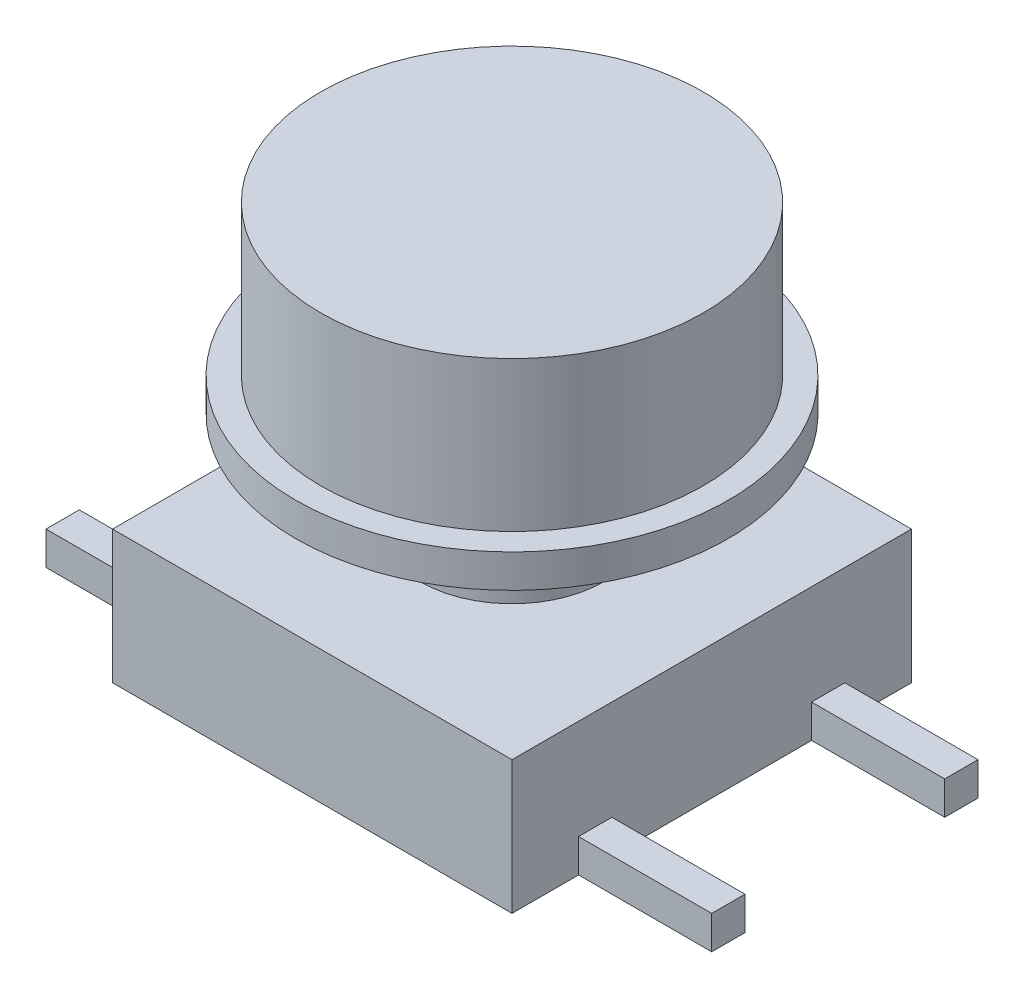
ISO-10303-21;
HEADER;
FILE_DESCRIPTION(('STEP AP214'),'2;1');
FILE_NAME('part.step','',(''),(''),'','','');
FILE_SCHEMA(('AUTOMOTIVE_DESIGN { 1 0 10303 214 1 1 1 1 }'));
ENDSEC;
DATA;
#1=APPLICATION_CONTEXT('core data for automotive mechanical design processes');
#2=APPLICATION_PROTOCOL_DEFINITION('international standard','automotive_design',2000,#1);
#3=PRODUCT_CONTEXT('',#1,'mechanical');
#4=PRODUCT('Part','Part','',(#3));
#5=PRODUCT_RELATED_PRODUCT_CATEGORY('part','',(#4));
#6=PRODUCT_DEFINITION_FORMATION('','',#4);
#7=PRODUCT_DEFINITION_CONTEXT('part definition',#1,'design');
#8=PRODUCT_DEFINITION('design','',#6,#7);
#9=PRODUCT_DEFINITION_SHAPE('','',#8);
#10=(LENGTH_UNIT() NAMED_UNIT(*) SI_UNIT(.MILLI.,.METRE.));
#11=(NAMED_UNIT(*) PLANE_ANGLE_UNIT() SI_UNIT($,.RADIAN.));
#12=(NAMED_UNIT(*) SI_UNIT($,.STERADIAN.) SOLID_ANGLE_UNIT());
#13=UNCERTAINTY_MEASURE_WITH_UNIT(LENGTH_MEASURE(1.E-05),#10,'distance_accuracy_value','');
#14=(GEOMETRIC_REPRESENTATION_CONTEXT(3) GLOBAL_UNCERTAINTY_ASSIGNED_CONTEXT((#13)) GLOBAL_UNIT_ASSIGNED_CONTEXT((#10,
#11,#12)) REPRESENTATION_CONTEXT('',''));
#15=CARTESIAN_POINT('',(0.,0.,0.));
#16=DIRECTION('',(0.,0.,1.));
#17=DIRECTION('',(1.,0.,0.));
#18=AXIS2_PLACEMENT_3D('',#15,#16,#17);
#19=CARTESIAN_POINT('',(-6.,4.,6.));
#20=DIRECTION('',(1.,0.,0.));
#21=DIRECTION('',(0.,0.,-1.));
#22=AXIS2_PLACEMENT_3D('',#19,#20,#21);
#23=PLANE('',#22);
#24=DIRECTION('',(0.,0.,1.));
#25=VECTOR('',#24,1.);
#26=CARTESIAN_POINT('',(-6.,0.,6.));
#27=LINE('',#26,#25);
#28=CARTESIAN_POINT('',(-6.,0.,-3.));
#29=VERTEX_POINT('',#28);
#30=CARTESIAN_POINT('',(-6.,0.,3.));
#31=VERTEX_POINT('',#30);
#32=EDGE_CURVE('E400',#29,#31,#27,.T.);
#33=ORIENTED_EDGE('',*,*,#32,.T.);
#34=DIRECTION('',(0.,1.,0.));
#35=VECTOR('',#34,1.);
#36=CARTESIAN_POINT('',(-6.,1.,3.));
#37=LINE('',#36,#35);
#38=CARTESIAN_POINT('',(-6.,1.,3.));
#39=VERTEX_POINT('',#38);
#40=EDGE_CURVE('E65',#31,#39,#37,.T.);
#41=ORIENTED_EDGE('',*,*,#40,.T.);
#42=DIRECTION('',(0.,0.,1.));
#43=VECTOR('',#42,1.);
#44=CARTESIAN_POINT('',(-6.,1.,4.));
#45=LINE('',#44,#43);
#46=CARTESIAN_POINT('',(-6.,1.,4.));
#47=VERTEX_POINT('',#46);
#48=EDGE_CURVE('E60',#39,#47,#45,.T.);
#49=ORIENTED_EDGE('',*,*,#48,.T.);
#50=DIRECTION('',(0.,-1.,0.));
#51=VECTOR('',#50,1.);
#52=CARTESIAN_POINT('',(-6.,1.,4.));
#53=LINE('',#52,#51);
#54=CARTESIAN_POINT('',(-6.,0.,4.));
#55=VERTEX_POINT('',#54);
#56=EDGE_CURVE('E218',#47,#55,#53,.T.);
#57=ORIENTED_EDGE('',*,*,#56,.T.);
#58=CARTESIAN_POINT('',(-6.,0.,6.));
#59=VERTEX_POINT('',#58);
#60=EDGE_CURVE('E396',#55,#59,#27,.T.);
#61=ORIENTED_EDGE('',*,*,#60,.T.);
#62=DIRECTION('',(0.,-1.,0.));
#63=VECTOR('',#62,1.);
#64=CARTESIAN_POINT('',(-6.,4.,6.));
#65=LINE('',#64,#63);
#66=CARTESIAN_POINT('',(-6.,4.,6.));
#67=VERTEX_POINT('',#66);
#68=EDGE_CURVE('E406',#67,#59,#65,.T.);
#69=ORIENTED_EDGE('',*,*,#68,.F.);
#70=DIRECTION('',(0.,0.,1.));
#71=VECTOR('',#70,1.);
#72=CARTESIAN_POINT('',(-6.,4.,6.));
#73=LINE('',#72,#71);
#74=CARTESIAN_POINT('',(-6.,4.,-6.));
#75=VERTEX_POINT('',#74);
#76=EDGE_CURVE('E382',#75,#67,#73,.T.);
#77=ORIENTED_EDGE('',*,*,#76,.F.);
#78=DIRECTION('',(0.,-1.,0.));
#79=VECTOR('',#78,1.);
#80=CARTESIAN_POINT('',(-6.,4.,-6.));
#81=LINE('',#80,#79);
#82=CARTESIAN_POINT('',(-6.,0.,-6.));
#83=VERTEX_POINT('',#82);
#84=EDGE_CURVE('E409',#75,#83,#81,.T.);
#85=ORIENTED_EDGE('',*,*,#84,.T.);
#86=CARTESIAN_POINT('',(-6.,0.,-4.));
#87=VERTEX_POINT('',#86);
#88=EDGE_CURVE('E397',#83,#87,#27,.T.);
#89=ORIENTED_EDGE('',*,*,#88,.T.);
#90=DIRECTION('',(0.,-1.,0.));
#91=VECTOR('',#90,1.);
#92=CARTESIAN_POINT('',(-6.,1.,-4.));
#93=LINE('',#92,#91);
#94=CARTESIAN_POINT('',(-6.,1.,-4.));
#95=VERTEX_POINT('',#94);
#96=EDGE_CURVE('E235',#95,#87,#93,.T.);
#97=ORIENTED_EDGE('',*,*,#96,.F.);
#98=DIRECTION('',(0.,0.,-1.));
#99=VECTOR('',#98,1.);
#100=CARTESIAN_POINT('',(-6.,1.,-4.));
#101=LINE('',#100,#99);
#102=CARTESIAN_POINT('',(-6.,1.,-3.));
#103=VERTEX_POINT('',#102);
#104=EDGE_CURVE('E248',#103,#95,#101,.T.);
#105=ORIENTED_EDGE('',*,*,#104,.F.);
#106=DIRECTION('',(0.,1.,0.));
#107=VECTOR('',#106,1.);
#108=CARTESIAN_POINT('',(-6.,1.,-3.));
#109=LINE('',#108,#107);
#110=EDGE_CURVE('E191',#29,#103,#109,.T.);
#111=ORIENTED_EDGE('',*,*,#110,.F.);
#112=EDGE_LOOP('',(#33,#41,#49,#57,#61,#69,#77,#85,#89,#97,#105,#111));
#113=FACE_BOUND('',#112,.T.);
#114=ADVANCED_FACE('F43',(#113),#23,.F.);
#115=CARTESIAN_POINT('',(6.,4.,6.));
#116=DIRECTION('',(-1.,0.,0.));
#117=DIRECTION('',(0.,0.,1.));
#118=AXIS2_PLACEMENT_3D('',#115,#116,#117);
#119=PLANE('',#118);
#120=DIRECTION('',(0.,0.,-1.));
#121=VECTOR('',#120,1.);
#122=CARTESIAN_POINT('',(6.,0.,6.));
#123=LINE('',#122,#121);
#124=CARTESIAN_POINT('',(6.,0.,3.));
#125=VERTEX_POINT('',#124);
#126=CARTESIAN_POINT('',(6.,0.,-3.));
#127=VERTEX_POINT('',#126);
#128=EDGE_CURVE('E393',#125,#127,#123,.T.);
#129=ORIENTED_EDGE('',*,*,#128,.T.);
#130=DIRECTION('',(0.,1.,0.));
#131=VECTOR('',#130,1.);
#132=CARTESIAN_POINT('',(6.,1.,-3.));
#133=LINE('',#132,#131);
#134=CARTESIAN_POINT('',(6.,1.,-3.));
#135=VERTEX_POINT('',#134);
#136=EDGE_CURVE('E270',#127,#135,#133,.T.);
#137=ORIENTED_EDGE('',*,*,#136,.T.);
#138=DIRECTION('',(0.,0.,-1.));
#139=VECTOR('',#138,1.);
#140=CARTESIAN_POINT('',(6.,1.,-4.));
#141=LINE('',#140,#139);
#142=CARTESIAN_POINT('',(6.,1.,-4.));
#143=VERTEX_POINT('',#142);
#144=EDGE_CURVE('E276',#135,#143,#141,.T.);
#145=ORIENTED_EDGE('',*,*,#144,.T.);
#146=DIRECTION('',(0.,-1.,0.));
#147=VECTOR('',#146,1.);
#148=CARTESIAN_POINT('',(6.,1.,-4.));
#149=LINE('',#148,#147);
#150=CARTESIAN_POINT('',(6.,0.,-4.));
#151=VERTEX_POINT('',#150);
#152=EDGE_CURVE('E291',#143,#151,#149,.T.);
#153=ORIENTED_EDGE('',*,*,#152,.T.);
#154=CARTESIAN_POINT('',(6.,0.,-6.));
#155=VERTEX_POINT('',#154);
#156=EDGE_CURVE('E372',#151,#155,#123,.T.);
#157=ORIENTED_EDGE('',*,*,#156,.T.);
#158=DIRECTION('',(0.,-1.,0.));
#159=VECTOR('',#158,1.);
#160=CARTESIAN_POINT('',(6.,4.,-6.));
#161=LINE('',#160,#159);
#162=CARTESIAN_POINT('',(6.,4.,-6.));
#163=VERTEX_POINT('',#162);
#164=EDGE_CURVE('E47',#163,#155,#161,.T.);
#165=ORIENTED_EDGE('',*,*,#164,.F.);
#166=DIRECTION('',(0.,0.,-1.));
#167=VECTOR('',#166,1.);
#168=CARTESIAN_POINT('',(6.,4.,6.));
#169=LINE('',#168,#167);
#170=CARTESIAN_POINT('',(6.,4.,6.));
#171=VERTEX_POINT('',#170);
#172=EDGE_CURVE('E374',#171,#163,#169,.T.);
#173=ORIENTED_EDGE('',*,*,#172,.F.);
#174=DIRECTION('',(0.,-1.,0.));
#175=VECTOR('',#174,1.);
#176=CARTESIAN_POINT('',(6.,4.,6.));
#177=LINE('',#176,#175);
#178=CARTESIAN_POINT('',(6.,0.,6.));
#179=VERTEX_POINT('',#178);
#180=EDGE_CURVE('E388',#171,#179,#177,.T.);
#181=ORIENTED_EDGE('',*,*,#180,.T.);
#182=CARTESIAN_POINT('',(6.,0.,4.));
#183=VERTEX_POINT('',#182);
#184=EDGE_CURVE('E389',#179,#183,#123,.T.);
#185=ORIENTED_EDGE('',*,*,#184,.T.);
#186=DIRECTION('',(0.,-1.,0.));
#187=VECTOR('',#186,1.);
#188=CARTESIAN_POINT('',(6.,1.,4.));
#189=LINE('',#188,#187);
#190=CARTESIAN_POINT('',(6.,1.,4.));
#191=VERTEX_POINT('',#190);
#192=EDGE_CURVE('E318',#191,#183,#189,.T.);
#193=ORIENTED_EDGE('',*,*,#192,.F.);
#194=DIRECTION('',(0.,0.,1.));
#195=VECTOR('',#194,1.);
#196=CARTESIAN_POINT('',(6.,1.,4.));
#197=LINE('',#196,#195);
#198=CARTESIAN_POINT('',(6.,1.,3.));
#199=VERTEX_POINT('',#198);
#200=EDGE_CURVE('E331',#199,#191,#197,.T.);
#201=ORIENTED_EDGE('',*,*,#200,.F.);
#202=DIRECTION('',(0.,1.,0.));
#203=VECTOR('',#202,1.);
#204=CARTESIAN_POINT('',(6.,1.,3.));
#205=LINE('',#204,#203);
#206=EDGE_CURVE('E312',#125,#199,#205,.T.);
#207=ORIENTED_EDGE('',*,*,#206,.F.);
#208=EDGE_LOOP('',(#129,#137,#145,#153,#157,#165,#173,#181,#185,#193,#201,#207));
#209=FACE_BOUND('',#208,.T.);
#210=ADVANCED_FACE('F45',(#209),#119,.F.);
#211=CARTESIAN_POINT('',(-6.,4.,-6.));
#212=DIRECTION('',(0.,0.,1.));
#213=DIRECTION('',(1.,0.,0.));
#214=AXIS2_PLACEMENT_3D('',#211,#212,#213);
#215=PLANE('',#214);
#216=DIRECTION('',(-1.,0.,0.));
#217=VECTOR('',#216,1.);
#218=CARTESIAN_POINT('',(-6.,0.,-6.));
#219=LINE('',#218,#217);
#220=EDGE_CURVE('E392',#155,#83,#219,.T.);
#221=ORIENTED_EDGE('',*,*,#220,.T.);
#222=ORIENTED_EDGE('',*,*,#84,.F.);
#223=DIRECTION('',(-1.,0.,0.));
#224=VECTOR('',#223,1.);
#225=CARTESIAN_POINT('',(-6.,4.,-6.));
#226=LINE('',#225,#224);
#227=EDGE_CURVE('E378',#163,#75,#226,.T.);
#228=ORIENTED_EDGE('',*,*,#227,.F.);
#229=ORIENTED_EDGE('',*,*,#164,.T.);
#230=EDGE_LOOP('',(#221,#222,#228,#229));
#231=FACE_BOUND('',#230,.T.);
#232=ADVANCED_FACE('F419',(#231),#215,.F.);
#233=CARTESIAN_POINT('',(-6.,4.,6.));
#234=DIRECTION('',(0.,0.,-1.));
#235=DIRECTION('',(-1.,0.,0.));
#236=AXIS2_PLACEMENT_3D('',#233,#234,#235);
#237=PLANE('',#236);
#238=DIRECTION('',(1.,0.,0.));
#239=VECTOR('',#238,1.);
#240=CARTESIAN_POINT('',(-6.,0.,6.));
#241=LINE('',#240,#239);
#242=EDGE_CURVE('E379',#59,#179,#241,.T.);
#243=ORIENTED_EDGE('',*,*,#242,.T.);
#244=ORIENTED_EDGE('',*,*,#180,.F.);
#245=DIRECTION('',(1.,0.,0.));
#246=VECTOR('',#245,1.);
#247=CARTESIAN_POINT('',(-6.,4.,6.));
#248=LINE('',#247,#246);
#249=EDGE_CURVE('E385',#67,#171,#248,.T.);
#250=ORIENTED_EDGE('',*,*,#249,.F.);
#251=ORIENTED_EDGE('',*,*,#68,.T.);
#252=EDGE_LOOP('',(#243,#244,#250,#251));
#253=FACE_BOUND('',#252,.T.);
#254=ADVANCED_FACE('F456',(#253),#237,.F.);
#255=CARTESIAN_POINT('',(0.,4.,0.));
#256=DIRECTION('',(0.,-1.,0.));
#257=DIRECTION('',(0.,0.,-1.));
#258=AXIS2_PLACEMENT_3D('',#255,#256,#257);
#259=PLANE('',#258);
#260=CARTESIAN_POINT('',(0.,4.,0.));
#261=DIRECTION('',(0.,1.,0.));
#262=DIRECTION('',(0.,0.,1.));
#263=AXIS2_PLACEMENT_3D('',#260,#261,#262);
#264=CIRCLE('',#263,2.75);
#265=CARTESIAN_POINT('',(0.,4.,2.75));
#266=VERTEX_POINT('',#265);
#267=EDGE_CURVE('E11',#266,#266,#264,.T.);
#268=ORIENTED_EDGE('',*,*,#267,.F.);
#269=EDGE_LOOP('',(#268));
#270=FACE_BOUND('',#269,.T.);
#271=ORIENTED_EDGE('',*,*,#172,.T.);
#272=ORIENTED_EDGE('',*,*,#227,.T.);
#273=ORIENTED_EDGE('',*,*,#76,.T.);
#274=ORIENTED_EDGE('',*,*,#249,.T.);
#275=EDGE_LOOP('',(#271,#272,#273,#274));
#276=FACE_BOUND('',#275,.T.);
#277=ADVANCED_FACE('F462',(#270,#276),#259,.F.);
#278=CARTESIAN_POINT('',(0.,0.,0.));
#279=DIRECTION('',(0.,-1.,0.));
#280=DIRECTION('',(0.,0.,-1.));
#281=AXIS2_PLACEMENT_3D('',#278,#279,#280);
#282=PLANE('',#281);
#283=ORIENTED_EDGE('',*,*,#184,.F.);
#284=ORIENTED_EDGE('',*,*,#242,.F.);
#285=ORIENTED_EDGE('',*,*,#60,.F.);
#286=DIRECTION('',(1.,0.,0.));
#287=VECTOR('',#286,1.);
#288=CARTESIAN_POINT('',(-10.,0.,4.));
#289=LINE('',#288,#287);
#290=CARTESIAN_POINT('',(-10.,0.,4.));
#291=VERTEX_POINT('',#290);
#292=EDGE_CURVE('E192',#291,#55,#289,.T.);
#293=ORIENTED_EDGE('',*,*,#292,.F.);
#294=DIRECTION('',(0.,0.,-1.));
#295=VECTOR('',#294,1.);
#296=CARTESIAN_POINT('',(-10.,0.,4.));
#297=LINE('',#296,#295);
#298=CARTESIAN_POINT('',(-10.,0.,3.));
#299=VERTEX_POINT('',#298);
#300=EDGE_CURVE('E198',#291,#299,#297,.T.);
#301=ORIENTED_EDGE('',*,*,#300,.T.);
#302=DIRECTION('',(1.,0.,0.));
#303=VECTOR('',#302,1.);
#304=CARTESIAN_POINT('',(-10.,0.,3.));
#305=LINE('',#304,#303);
#306=EDGE_CURVE('E182',#299,#31,#305,.T.);
#307=ORIENTED_EDGE('',*,*,#306,.T.);
#308=ORIENTED_EDGE('',*,*,#32,.F.);
#309=DIRECTION('',(1.,0.,0.));
#310=VECTOR('',#309,1.);
#311=CARTESIAN_POINT('',(-10.,0.,-3.));
#312=LINE('',#311,#310);
#313=CARTESIAN_POINT('',(-10.,0.,-3.));
#314=VERTEX_POINT('',#313);
#315=EDGE_CURVE('E244',#314,#29,#312,.T.);
#316=ORIENTED_EDGE('',*,*,#315,.F.);
#317=DIRECTION('',(0.,0.,1.));
#318=VECTOR('',#317,1.);
#319=CARTESIAN_POINT('',(-10.,0.,-4.));
#320=LINE('',#319,#318);
#321=CARTESIAN_POINT('',(-10.,0.,-4.));
#322=VERTEX_POINT('',#321);
#323=EDGE_CURVE('E241',#322,#314,#320,.T.);
#324=ORIENTED_EDGE('',*,*,#323,.F.);
#325=DIRECTION('',(1.,0.,0.));
#326=VECTOR('',#325,1.);
#327=CARTESIAN_POINT('',(-10.,0.,-4.));
#328=LINE('',#327,#326);
#329=EDGE_CURVE('E258',#322,#87,#328,.T.);
#330=ORIENTED_EDGE('',*,*,#329,.T.);
#331=ORIENTED_EDGE('',*,*,#88,.F.);
#332=ORIENTED_EDGE('',*,*,#220,.F.);
#333=ORIENTED_EDGE('',*,*,#156,.F.);
#334=DIRECTION('',(-1.,0.,0.));
#335=VECTOR('',#334,1.);
#336=CARTESIAN_POINT('',(10.,0.,-4.));
#337=LINE('',#336,#335);
#338=CARTESIAN_POINT('',(10.,0.,-4.));
#339=VERTEX_POINT('',#338);
#340=EDGE_CURVE('E304',#339,#151,#337,.T.);
#341=ORIENTED_EDGE('',*,*,#340,.F.);
#342=DIRECTION('',(0.,0.,1.));
#343=VECTOR('',#342,1.);
#344=CARTESIAN_POINT('',(10.,0.,-4.));
#345=LINE('',#344,#343);
#346=CARTESIAN_POINT('',(10.,0.,-3.));
#347=VERTEX_POINT('',#346);
#348=EDGE_CURVE('E275',#339,#347,#345,.T.);
#349=ORIENTED_EDGE('',*,*,#348,.T.);
#350=DIRECTION('',(-1.,0.,0.));
#351=VECTOR('',#350,1.);
#352=CARTESIAN_POINT('',(10.,0.,-3.));
#353=LINE('',#352,#351);
#354=EDGE_CURVE('E308',#347,#127,#353,.T.);
#355=ORIENTED_EDGE('',*,*,#354,.T.);
#356=ORIENTED_EDGE('',*,*,#128,.F.);
#357=DIRECTION('',(-1.,0.,0.));
#358=VECTOR('',#357,1.);
#359=CARTESIAN_POINT('',(10.,0.,3.));
#360=LINE('',#359,#358);
#361=CARTESIAN_POINT('',(10.,0.,3.));
#362=VERTEX_POINT('',#361);
#363=EDGE_CURVE('E327',#362,#125,#360,.T.);
#364=ORIENTED_EDGE('',*,*,#363,.F.);
#365=DIRECTION('',(0.,0.,-1.));
#366=VECTOR('',#365,1.);
#367=CARTESIAN_POINT('',(10.,0.,4.));
#368=LINE('',#367,#366);
#369=CARTESIAN_POINT('',(10.,0.,4.));
#370=VERTEX_POINT('',#369);
#371=EDGE_CURVE('E324',#370,#362,#368,.T.);
#372=ORIENTED_EDGE('',*,*,#371,.F.);
#373=DIRECTION('',(-1.,0.,0.));
#374=VECTOR('',#373,1.);
#375=CARTESIAN_POINT('',(10.,0.,4.));
#376=LINE('',#375,#374);
#377=EDGE_CURVE('E341',#370,#183,#376,.T.);
#378=ORIENTED_EDGE('',*,*,#377,.T.);
#379=EDGE_LOOP('',(#283,#284,#285,#293,#301,#307,#308,#316,#324,#330,#331,#332,#333,#341,#349,
#355,#356,#364,#372,#378));
#380=FACE_BOUND('',#379,.T.);
#381=ADVANCED_FACE('F205',(#380),#282,.T.);
#382=CARTESIAN_POINT('',(0.,7.,0.));
#383=DIRECTION('',(0.,-1.,0.));
#384=DIRECTION('',(0.,0.,-1.));
#385=AXIS2_PLACEMENT_3D('',#382,#383,#384);
#386=CYLINDRICAL_SURFACE('',#385,2.75);
#387=CARTESIAN_POINT('',(0.,7.,0.));
#388=DIRECTION('',(0.,1.,0.));
#389=DIRECTION('',(0.,0.,1.));
#390=AXIS2_PLACEMENT_3D('',#387,#388,#389);
#391=CIRCLE('',#390,2.75);
#392=CARTESIAN_POINT('',(0.,7.,2.75));
#393=VERTEX_POINT('',#392);
#394=EDGE_CURVE('E366',#393,#393,#391,.T.);
#395=ORIENTED_EDGE('',*,*,#394,.F.);
#396=EDGE_LOOP('',(#395));
#397=FACE_BOUND('',#396,.T.);
#398=ORIENTED_EDGE('',*,*,#267,.T.);
#399=EDGE_LOOP('',(#398));
#400=FACE_BOUND('',#399,.T.);
#401=ADVANCED_FACE('F549',(#397,#400),#386,.T.);
#402=CARTESIAN_POINT('',(0.,8.,0.));
#403=DIRECTION('',(0.,-1.,0.));
#404=DIRECTION('',(0.,0.,-1.));
#405=AXIS2_PLACEMENT_3D('',#402,#403,#404);
#406=CYLINDRICAL_SURFACE('',#405,6.5);
#407=CARTESIAN_POINT('',(0.,8.,0.));
#408=DIRECTION('',(0.,1.,0.));
#409=DIRECTION('',(0.,0.,1.));
#410=AXIS2_PLACEMENT_3D('',#407,#408,#409);
#411=CIRCLE('',#410,6.5);
#412=CARTESIAN_POINT('',(0.,8.,6.5));
#413=VERTEX_POINT('',#412);
#414=EDGE_CURVE('E362',#413,#413,#411,.T.);
#415=ORIENTED_EDGE('',*,*,#414,.F.);
#416=EDGE_LOOP('',(#415));
#417=FACE_BOUND('',#416,.T.);
#418=CARTESIAN_POINT('',(0.,7.,0.));
#419=DIRECTION('',(0.,1.,0.));
#420=DIRECTION('',(0.,0.,1.));
#421=AXIS2_PLACEMENT_3D('',#418,#419,#420);
#422=CIRCLE('',#421,6.5);
#423=CARTESIAN_POINT('',(0.,7.,6.5));
#424=VERTEX_POINT('',#423);
#425=EDGE_CURVE('E361',#424,#424,#422,.T.);
#426=ORIENTED_EDGE('',*,*,#425,.T.);
#427=EDGE_LOOP('',(#426));
#428=FACE_BOUND('',#427,.T.);
#429=ADVANCED_FACE('F686',(#417,#428),#406,.T.);
#430=CARTESIAN_POINT('',(0.,8.,0.));
#431=DIRECTION('',(0.,1.,0.));
#432=DIRECTION('',(0.,0.,1.));
#433=AXIS2_PLACEMENT_3D('',#430,#431,#432);
#434=PLANE('',#433);
#435=CARTESIAN_POINT('',(0.,8.,0.));
#436=DIRECTION('',(0.,1.,0.));
#437=DIRECTION('',(0.,0.,1.));
#438=AXIS2_PLACEMENT_3D('',#435,#436,#437);
#439=CIRCLE('',#438,5.75);
#440=CARTESIAN_POINT('',(0.,8.,5.75));
#441=VERTEX_POINT('',#440);
#442=EDGE_CURVE('E357',#441,#441,#439,.F.);
#443=ORIENTED_EDGE('',*,*,#442,.T.);
#444=EDGE_LOOP('',(#443));
#445=FACE_BOUND('',#444,.T.);
#446=ORIENTED_EDGE('',*,*,#414,.T.);
#447=EDGE_LOOP('',(#446));
#448=FACE_BOUND('',#447,.T.);
#449=ADVANCED_FACE('F675',(#445,#448),#434,.T.);
#450=CARTESIAN_POINT('',(0.,7.,0.));
#451=DIRECTION('',(0.,1.,0.));
#452=DIRECTION('',(0.,0.,1.));
#453=AXIS2_PLACEMENT_3D('',#450,#451,#452);
#454=PLANE('',#453);
#455=ORIENTED_EDGE('',*,*,#425,.F.);
#456=EDGE_LOOP('',(#455));
#457=FACE_BOUND('',#456,.T.);
#458=ORIENTED_EDGE('',*,*,#394,.T.);
#459=EDGE_LOOP('',(#458));
#460=FACE_BOUND('',#459,.T.);
#461=ADVANCED_FACE('F664',(#457,#460),#454,.F.);
#462=CARTESIAN_POINT('',(0.,12.5,0.));
#463=DIRECTION('',(0.,-1.,0.));
#464=DIRECTION('',(0.,0.,-1.));
#465=AXIS2_PLACEMENT_3D('',#462,#463,#464);
#466=CYLINDRICAL_SURFACE('',#465,5.75);
#467=ORIENTED_EDGE('',*,*,#442,.F.);
#468=EDGE_LOOP('',(#467));
#469=FACE_BOUND('',#468,.T.);
#470=CARTESIAN_POINT('',(0.,12.5,0.));
#471=DIRECTION('',(0.,1.,0.));
#472=DIRECTION('',(0.,0.,1.));
#473=AXIS2_PLACEMENT_3D('',#470,#471,#472);
#474=CIRCLE('',#473,5.75);
#475=CARTESIAN_POINT('',(0.,12.5,5.75));
#476=VERTEX_POINT('',#475);
#477=EDGE_CURVE('E353',#476,#476,#474,.T.);
#478=ORIENTED_EDGE('',*,*,#477,.F.);
#479=EDGE_LOOP('',(#478));
#480=FACE_BOUND('',#479,.T.);
#481=ADVANCED_FACE('F654',(#469,#480),#466,.T.);
#482=CARTESIAN_POINT('',(0.,12.5,0.));
#483=DIRECTION('',(0.,1.,0.));
#484=DIRECTION('',(0.,0.,1.));
#485=AXIS2_PLACEMENT_3D('',#482,#483,#484);
#486=PLANE('',#485);
#487=ORIENTED_EDGE('',*,*,#477,.T.);
#488=EDGE_LOOP('',(#487));
#489=FACE_BOUND('',#488,.T.);
#490=ADVANCED_FACE('F644',(#489),#486,.T.);
#491=CARTESIAN_POINT('',(10.,1.,3.));
#492=DIRECTION('',(0.,0.,1.));
#493=DIRECTION('',(0.,-1.,0.));
#494=AXIS2_PLACEMENT_3D('',#491,#492,#493);
#495=PLANE('',#494);
#496=ORIENTED_EDGE('',*,*,#206,.T.);
#497=DIRECTION('',(-1.,0.,0.));
#498=VECTOR('',#497,1.);
#499=CARTESIAN_POINT('',(10.,1.,3.));
#500=LINE('',#499,#498);
#501=CARTESIAN_POINT('',(10.,1.,3.));
#502=VERTEX_POINT('',#501);
#503=EDGE_CURVE('E349',#502,#199,#500,.T.);
#504=ORIENTED_EDGE('',*,*,#503,.F.);
#505=DIRECTION('',(0.,1.,0.));
#506=VECTOR('',#505,1.);
#507=CARTESIAN_POINT('',(10.,1.,3.));
#508=LINE('',#507,#506);
#509=EDGE_CURVE('E313',#362,#502,#508,.T.);
#510=ORIENTED_EDGE('',*,*,#509,.F.);
#511=ORIENTED_EDGE('',*,*,#363,.T.);
#512=EDGE_LOOP('',(#496,#504,#510,#511));
#513=FACE_BOUND('',#512,.T.);
#514=ADVANCED_FACE('F485',(#513),#495,.F.);
#515=CARTESIAN_POINT('',(10.,1.,4.));
#516=DIRECTION('',(0.,-1.,0.));
#517=DIRECTION('',(0.,0.,-1.));
#518=AXIS2_PLACEMENT_3D('',#515,#516,#517);
#519=PLANE('',#518);
#520=ORIENTED_EDGE('',*,*,#200,.T.);
#521=DIRECTION('',(-1.,0.,0.));
#522=VECTOR('',#521,1.);
#523=CARTESIAN_POINT('',(10.,1.,4.));
#524=LINE('',#523,#522);
#525=CARTESIAN_POINT('',(10.,1.,4.));
#526=VERTEX_POINT('',#525);
#527=EDGE_CURVE('E345',#526,#191,#524,.T.);
#528=ORIENTED_EDGE('',*,*,#527,.F.);
#529=DIRECTION('',(0.,0.,1.));
#530=VECTOR('',#529,1.);
#531=CARTESIAN_POINT('',(10.,1.,4.));
#532=LINE('',#531,#530);
#533=EDGE_CURVE('E317',#502,#526,#532,.T.);
#534=ORIENTED_EDGE('',*,*,#533,.F.);
#535=ORIENTED_EDGE('',*,*,#503,.T.);
#536=EDGE_LOOP('',(#520,#528,#534,#535));
#537=FACE_BOUND('',#536,.T.);
#538=ADVANCED_FACE('F481',(#537),#519,.F.);
#539=CARTESIAN_POINT('',(10.,1.,4.));
#540=DIRECTION('',(0.,0.,-1.));
#541=DIRECTION('',(-1.,0.,0.));
#542=AXIS2_PLACEMENT_3D('',#539,#540,#541);
#543=PLANE('',#542);
#544=ORIENTED_EDGE('',*,*,#192,.T.);
#545=ORIENTED_EDGE('',*,*,#377,.F.);
#546=DIRECTION('',(0.,-1.,0.));
#547=VECTOR('',#546,1.);
#548=CARTESIAN_POINT('',(10.,1.,4.));
#549=LINE('',#548,#547);
#550=EDGE_CURVE('E321',#526,#370,#549,.T.);
#551=ORIENTED_EDGE('',*,*,#550,.F.);
#552=ORIENTED_EDGE('',*,*,#527,.T.);
#553=EDGE_LOOP('',(#544,#545,#551,#552));
#554=FACE_BOUND('',#553,.T.);
#555=ADVANCED_FACE('F478',(#554),#543,.F.);
#556=CARTESIAN_POINT('',(10.,0.,0.));
#557=DIRECTION('',(1.,0.,0.));
#558=DIRECTION('',(0.,0.,-1.));
#559=AXIS2_PLACEMENT_3D('',#556,#557,#558);
#560=PLANE('',#559);
#561=ORIENTED_EDGE('',*,*,#509,.T.);
#562=ORIENTED_EDGE('',*,*,#533,.T.);
#563=ORIENTED_EDGE('',*,*,#550,.T.);
#564=ORIENTED_EDGE('',*,*,#371,.T.);
#565=EDGE_LOOP('',(#561,#562,#563,#564));
#566=FACE_BOUND('',#565,.T.);
#567=ADVANCED_FACE('F596',(#566),#560,.T.);
#568=CARTESIAN_POINT('',(10.,1.,-3.));
#569=DIRECTION('',(0.,0.,1.));
#570=DIRECTION('',(0.,-1.,0.));
#571=AXIS2_PLACEMENT_3D('',#568,#569,#570);
#572=PLANE('',#571);
#573=ORIENTED_EDGE('',*,*,#136,.F.);
#574=ORIENTED_EDGE('',*,*,#354,.F.);
#575=DIRECTION('',(0.,1.,0.));
#576=VECTOR('',#575,1.);
#577=CARTESIAN_POINT('',(10.,1.,-3.));
#578=LINE('',#577,#576);
#579=CARTESIAN_POINT('',(10.,1.,-3.));
#580=VERTEX_POINT('',#579);
#581=EDGE_CURVE('E271',#347,#580,#578,.T.);
#582=ORIENTED_EDGE('',*,*,#581,.T.);
#583=DIRECTION('',(-1.,0.,0.));
#584=VECTOR('',#583,1.);
#585=CARTESIAN_POINT('',(10.,1.,-3.));
#586=LINE('',#585,#584);
#587=EDGE_CURVE('E288',#580,#135,#586,.T.);
#588=ORIENTED_EDGE('',*,*,#587,.T.);
#589=EDGE_LOOP('',(#573,#574,#582,#588));
#590=FACE_BOUND('',#589,.T.);
#591=ADVANCED_FACE('F585',(#590),#572,.T.);
#592=CARTESIAN_POINT('',(10.,1.,-4.));
#593=DIRECTION('',(0.,0.,-1.));
#594=DIRECTION('',(-1.,0.,0.));
#595=AXIS2_PLACEMENT_3D('',#592,#593,#594);
#596=PLANE('',#595);
#597=ORIENTED_EDGE('',*,*,#152,.F.);
#598=DIRECTION('',(-1.,0.,0.));
#599=VECTOR('',#598,1.);
#600=CARTESIAN_POINT('',(10.,1.,-4.));
#601=LINE('',#600,#599);
#602=CARTESIAN_POINT('',(10.,1.,-4.));
#603=VERTEX_POINT('',#602);
#604=EDGE_CURVE('E300',#603,#143,#601,.T.);
#605=ORIENTED_EDGE('',*,*,#604,.F.);
#606=DIRECTION('',(0.,-1.,0.));
#607=VECTOR('',#606,1.);
#608=CARTESIAN_POINT('',(10.,1.,-4.));
#609=LINE('',#608,#607);
#610=EDGE_CURVE('E280',#603,#339,#609,.T.);
#611=ORIENTED_EDGE('',*,*,#610,.T.);
#612=ORIENTED_EDGE('',*,*,#340,.T.);
#613=EDGE_LOOP('',(#597,#605,#611,#612));
#614=FACE_BOUND('',#613,.T.);
#615=ADVANCED_FACE('F574',(#614),#596,.T.);
#616=CARTESIAN_POINT('',(10.,1.,-4.));
#617=DIRECTION('',(0.,1.,0.));
#618=DIRECTION('',(0.,0.,1.));
#619=AXIS2_PLACEMENT_3D('',#616,#617,#618);
#620=PLANE('',#619);
#621=ORIENTED_EDGE('',*,*,#144,.F.);
#622=ORIENTED_EDGE('',*,*,#587,.F.);
#623=DIRECTION('',(0.,0.,-1.));
#624=VECTOR('',#623,1.);
#625=CARTESIAN_POINT('',(10.,1.,-4.));
#626=LINE('',#625,#624);
#627=EDGE_CURVE('E284',#580,#603,#626,.T.);
#628=ORIENTED_EDGE('',*,*,#627,.T.);
#629=ORIENTED_EDGE('',*,*,#604,.T.);
#630=EDGE_LOOP('',(#621,#622,#628,#629));
#631=FACE_BOUND('',#630,.T.);
#632=ADVANCED_FACE('F564',(#631),#620,.T.);
#633=CARTESIAN_POINT('',(10.,0.,0.));
#634=DIRECTION('',(1.,0.,0.));
#635=DIRECTION('',(0.,0.,1.));
#636=AXIS2_PLACEMENT_3D('',#633,#634,#635);
#637=PLANE('',#636);
#638=ORIENTED_EDGE('',*,*,#581,.F.);
#639=ORIENTED_EDGE('',*,*,#348,.F.);
#640=ORIENTED_EDGE('',*,*,#610,.F.);
#641=ORIENTED_EDGE('',*,*,#627,.F.);
#642=EDGE_LOOP('',(#638,#639,#640,#641));
#643=FACE_BOUND('',#642,.T.);
#644=ADVANCED_FACE('F539',(#643),#637,.T.);
#645=CARTESIAN_POINT('',(-10.,1.,-3.));
#646=DIRECTION('',(0.,0.,-1.));
#647=DIRECTION('',(0.,1.,0.));
#648=AXIS2_PLACEMENT_3D('',#645,#646,#647);
#649=PLANE('',#648);
#650=ORIENTED_EDGE('',*,*,#110,.T.);
#651=DIRECTION('',(1.,0.,0.));
#652=VECTOR('',#651,1.);
#653=CARTESIAN_POINT('',(-10.,1.,-3.));
#654=LINE('',#653,#652);
#655=CARTESIAN_POINT('',(-10.,1.,-3.));
#656=VERTEX_POINT('',#655);
#657=EDGE_CURVE('E266',#656,#103,#654,.T.);
#658=ORIENTED_EDGE('',*,*,#657,.F.);
#659=DIRECTION('',(0.,1.,0.));
#660=VECTOR('',#659,1.);
#661=CARTESIAN_POINT('',(-10.,1.,-3.));
#662=LINE('',#661,#660);
#663=EDGE_CURVE('E230',#314,#656,#662,.T.);
#664=ORIENTED_EDGE('',*,*,#663,.F.);
#665=ORIENTED_EDGE('',*,*,#315,.T.);
#666=EDGE_LOOP('',(#650,#658,#664,#665));
#667=FACE_BOUND('',#666,.T.);
#668=ADVANCED_FACE('F438',(#667),#649,.F.);
#669=CARTESIAN_POINT('',(-10.,1.,-4.));
#670=DIRECTION('',(0.,-1.,0.));
#671=DIRECTION('',(0.,0.,-1.));
#672=AXIS2_PLACEMENT_3D('',#669,#670,#671);
#673=PLANE('',#672);
#674=ORIENTED_EDGE('',*,*,#104,.T.);
#675=DIRECTION('',(1.,0.,0.));
#676=VECTOR('',#675,1.);
#677=CARTESIAN_POINT('',(-10.,1.,-4.));
#678=LINE('',#677,#676);
#679=CARTESIAN_POINT('',(-10.,1.,-4.));
#680=VERTEX_POINT('',#679);
#681=EDGE_CURVE('E262',#680,#95,#678,.T.);
#682=ORIENTED_EDGE('',*,*,#681,.F.);
#683=DIRECTION('',(0.,0.,-1.));
#684=VECTOR('',#683,1.);
#685=CARTESIAN_POINT('',(-10.,1.,-4.));
#686=LINE('',#685,#684);
#687=EDGE_CURVE('E234',#656,#680,#686,.T.);
#688=ORIENTED_EDGE('',*,*,#687,.F.);
#689=ORIENTED_EDGE('',*,*,#657,.T.);
#690=EDGE_LOOP('',(#674,#682,#688,#689));
#691=FACE_BOUND('',#690,.T.);
#692=ADVANCED_FACE('F432',(#691),#673,.F.);
#693=CARTESIAN_POINT('',(-10.,1.,-4.));
#694=DIRECTION('',(0.,0.,1.));
#695=DIRECTION('',(1.,0.,0.));
#696=AXIS2_PLACEMENT_3D('',#693,#694,#695);
#697=PLANE('',#696);
#698=ORIENTED_EDGE('',*,*,#96,.T.);
#699=ORIENTED_EDGE('',*,*,#329,.F.);
#700=DIRECTION('',(0.,-1.,0.));
#701=VECTOR('',#700,1.);
#702=CARTESIAN_POINT('',(-10.,1.,-4.));
#703=LINE('',#702,#701);
#704=EDGE_CURVE('E238',#680,#322,#703,.T.);
#705=ORIENTED_EDGE('',*,*,#704,.F.);
#706=ORIENTED_EDGE('',*,*,#681,.T.);
#707=EDGE_LOOP('',(#698,#699,#705,#706));
#708=FACE_BOUND('',#707,.T.);
#709=ADVANCED_FACE('F428',(#708),#697,.F.);
#710=CARTESIAN_POINT('',(-10.,0.,0.));
#711=DIRECTION('',(-1.,0.,0.));
#712=DIRECTION('',(0.,0.,1.));
#713=AXIS2_PLACEMENT_3D('',#710,#711,#712);
#714=PLANE('',#713);
#715=ORIENTED_EDGE('',*,*,#663,.T.);
#716=ORIENTED_EDGE('',*,*,#687,.T.);
#717=ORIENTED_EDGE('',*,*,#704,.T.);
#718=ORIENTED_EDGE('',*,*,#323,.T.);
#719=EDGE_LOOP('',(#715,#716,#717,#718));
#720=FACE_BOUND('',#719,.T.);
#721=ADVANCED_FACE('F440',(#720),#714,.T.);
#722=CARTESIAN_POINT('',(-10.,1.,3.));
#723=DIRECTION('',(0.,0.,-1.));
#724=DIRECTION('',(0.,1.,0.));
#725=AXIS2_PLACEMENT_3D('',#722,#723,#724);
#726=PLANE('',#725);
#727=ORIENTED_EDGE('',*,*,#40,.F.);
#728=ORIENTED_EDGE('',*,*,#306,.F.);
#729=DIRECTION('',(0.,1.,0.));
#730=VECTOR('',#729,1.);
#731=CARTESIAN_POINT('',(-10.,1.,3.));
#732=LINE('',#731,#730);
#733=CARTESIAN_POINT('',(-10.,1.,3.));
#734=VERTEX_POINT('',#733);
#735=EDGE_CURVE('E185',#299,#734,#732,.T.);
#736=ORIENTED_EDGE('',*,*,#735,.T.);
#737=DIRECTION('',(1.,0.,0.));
#738=VECTOR('',#737,1.);
#739=CARTESIAN_POINT('',(-10.,1.,3.));
#740=LINE('',#739,#738);
#741=EDGE_CURVE('E215',#734,#39,#740,.T.);
#742=ORIENTED_EDGE('',*,*,#741,.T.);
#743=EDGE_LOOP('',(#727,#728,#736,#742));
#744=FACE_BOUND('',#743,.T.);
#745=ADVANCED_FACE('F184',(#744),#726,.T.);
#746=CARTESIAN_POINT('',(-10.,1.,4.));
#747=DIRECTION('',(0.,0.,1.));
#748=DIRECTION('',(1.,0.,0.));
#749=AXIS2_PLACEMENT_3D('',#746,#747,#748);
#750=PLANE('',#749);
#751=ORIENTED_EDGE('',*,*,#56,.F.);
#752=DIRECTION('',(1.,0.,0.));
#753=VECTOR('',#752,1.);
#754=CARTESIAN_POINT('',(-10.,1.,4.));
#755=LINE('',#754,#753);
#756=CARTESIAN_POINT('',(-10.,1.,4.));
#757=VERTEX_POINT('',#756);
#758=EDGE_CURVE('E225',#757,#47,#755,.T.);
#759=ORIENTED_EDGE('',*,*,#758,.F.);
#760=DIRECTION('',(0.,-1.,0.));
#761=VECTOR('',#760,1.);
#762=CARTESIAN_POINT('',(-10.,1.,4.));
#763=LINE('',#762,#761);
#764=EDGE_CURVE('E208',#757,#291,#763,.T.);
#765=ORIENTED_EDGE('',*,*,#764,.T.);
#766=ORIENTED_EDGE('',*,*,#292,.T.);
#767=EDGE_LOOP('',(#751,#759,#765,#766));
#768=FACE_BOUND('',#767,.T.);
#769=ADVANCED_FACE('F447',(#768),#750,.T.);
#770=CARTESIAN_POINT('',(-10.,1.,4.));
#771=DIRECTION('',(0.,1.,0.));
#772=DIRECTION('',(0.,0.,1.));
#773=AXIS2_PLACEMENT_3D('',#770,#771,#772);
#774=PLANE('',#773);
#775=ORIENTED_EDGE('',*,*,#48,.F.);
#776=ORIENTED_EDGE('',*,*,#741,.F.);
#777=DIRECTION('',(0.,0.,1.));
#778=VECTOR('',#777,1.);
#779=CARTESIAN_POINT('',(-10.,1.,4.));
#780=LINE('',#779,#778);
#781=EDGE_CURVE('E201',#734,#757,#780,.T.);
#782=ORIENTED_EDGE('',*,*,#781,.T.);
#783=ORIENTED_EDGE('',*,*,#758,.T.);
#784=EDGE_LOOP('',(#775,#776,#782,#783));
#785=FACE_BOUND('',#784,.T.);
#786=ADVANCED_FACE('F493',(#785),#774,.T.);
#787=CARTESIAN_POINT('',(-10.,0.,0.));
#788=DIRECTION('',(-1.,0.,0.));
#789=DIRECTION('',(0.,0.,-1.));
#790=AXIS2_PLACEMENT_3D('',#787,#788,#789);
#791=PLANE('',#790);
#792=ORIENTED_EDGE('',*,*,#735,.F.);
#793=ORIENTED_EDGE('',*,*,#300,.F.);
#794=ORIENTED_EDGE('',*,*,#764,.F.);
#795=ORIENTED_EDGE('',*,*,#781,.F.);
#796=EDGE_LOOP('',(#792,#793,#794,#795));
#797=FACE_BOUND('',#796,.T.);
#798=ADVANCED_FACE('F196',(#797),#791,.T.);
#799=CLOSED_SHELL('',(#114,#210,#232,#254,#277,#381,#401,#429,#449,#461,#481,#490,#514,#538,
#555,#567,#591,#615,#632,#644,#668,#692,#709,#721,#745,#769,#786,#798));
#800=MANIFOLD_SOLID_BREP('B2',#799);
#801=ADVANCED_BREP_SHAPE_REPRESENTATION('',(#18,#800),#14);
#802=SHAPE_DEFINITION_REPRESENTATION(#9,#801);
ENDSEC;
END-ISO-10303-21;
